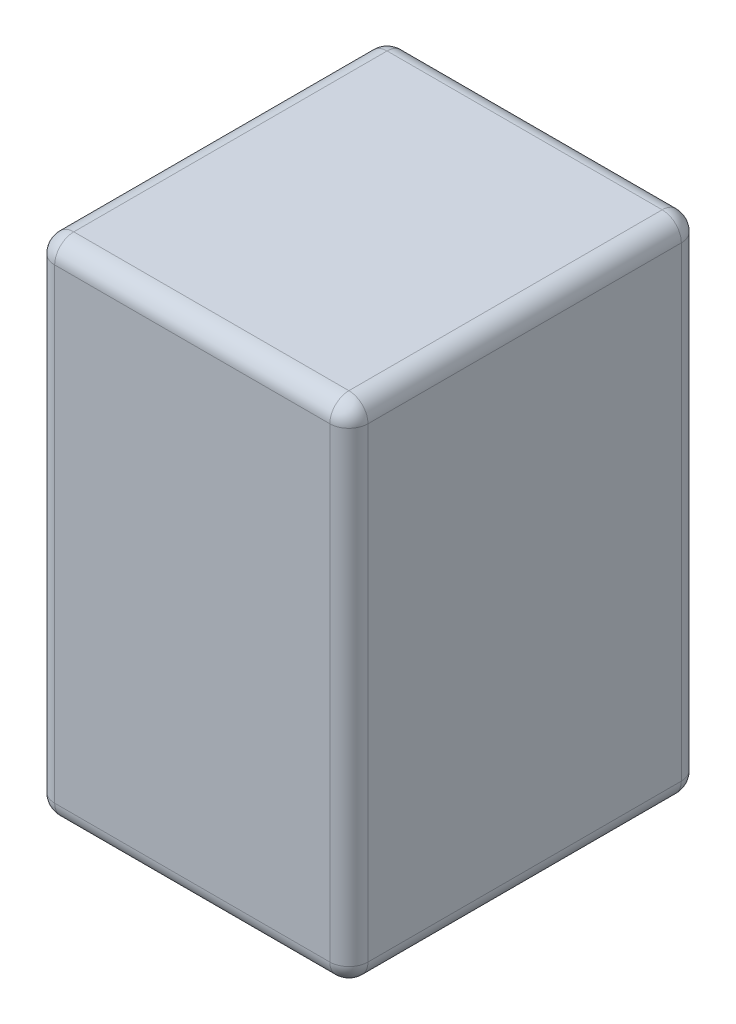
ISO-10303-21;
HEADER;
FILE_DESCRIPTION(('STEP AP214'),'2;1');
FILE_NAME('part.step','',(''),(''),'','','');
FILE_SCHEMA(('AUTOMOTIVE_DESIGN { 1 0 10303 214 1 1 1 1 }'));
ENDSEC;
DATA;
#1=APPLICATION_CONTEXT('core data for automotive mechanical design processes');
#2=APPLICATION_PROTOCOL_DEFINITION('international standard','automotive_design',2000,#1);
#3=PRODUCT_CONTEXT('',#1,'mechanical');
#4=PRODUCT('Part','Part','',(#3));
#5=PRODUCT_RELATED_PRODUCT_CATEGORY('part','',(#4));
#6=PRODUCT_DEFINITION_FORMATION('','',#4);
#7=PRODUCT_DEFINITION_CONTEXT('part definition',#1,'design');
#8=PRODUCT_DEFINITION('design','',#6,#7);
#9=PRODUCT_DEFINITION_SHAPE('','',#8);
#10=(LENGTH_UNIT() NAMED_UNIT(*) SI_UNIT(.MILLI.,.METRE.));
#11=(NAMED_UNIT(*) PLANE_ANGLE_UNIT() SI_UNIT($,.RADIAN.));
#12=(NAMED_UNIT(*) SI_UNIT($,.STERADIAN.) SOLID_ANGLE_UNIT());
#13=UNCERTAINTY_MEASURE_WITH_UNIT(LENGTH_MEASURE(1.E-05),#10,'distance_accuracy_value','');
#14=(GEOMETRIC_REPRESENTATION_CONTEXT(3) GLOBAL_UNCERTAINTY_ASSIGNED_CONTEXT((#13)) GLOBAL_UNIT_ASSIGNED_CONTEXT((#10,
#11,#12)) REPRESENTATION_CONTEXT('',''));
#15=CARTESIAN_POINT('',(0.,0.,0.));
#16=DIRECTION('',(0.,0.,1.));
#17=DIRECTION('',(1.,0.,0.));
#18=AXIS2_PLACEMENT_3D('',#15,#16,#17);
#19=CARTESIAN_POINT('',(-1.290000620004,-1.585000628965,-1.696601987956));
#20=DIRECTION('',(-0.577350243952984,0.577350243952984,0.577350319662907));
#21=DIRECTION('',(-0.707106812094995,-0.707106750278096,-6.18168906341143E-08));
#22=AXIS2_PLACEMENT_3D('',#19,#20,#21);
#23=SPHERICAL_SURFACE('',#22,0.075);
#24=CARTESIAN_POINT('',(-1.33330188830047,-1.54169936066853,-1.65330071398128));
#25=VERTEX_POINT('',#24);
#26=VERTEX_LOOP('',#25);
#27=FACE_BOUND('',#26,.T.);
#28=CARTESIAN_POINT('',(-1.29000062000394,-1.58500062896529,-1.69660198795589));
#29=DIRECTION('',(4.37113884619598E-08,0.999999999999995,8.74227765734796E-08));
#30=DIRECTION('',(0.,-8.74227765734797E-08,0.999999999999996));
#31=AXIS2_PLACEMENT_3D('',#28,#29,#30);
#32=CIRCLE('',#31,0.075);
#33=CARTESIAN_POINT('',(-1.29000065999997,-1.585000635522,-1.62160198795552));
#34=VERTEX_POINT('',#33);
#35=CARTESIAN_POINT('',(-1.36500062000399,-1.58500062568698,-1.69660198795594));
#36=VERTEX_POINT('',#35);
#37=EDGE_CURVE('E129',#34,#36,#32,.F.);
#38=ORIENTED_EDGE('',*,*,#37,.F.);
#39=CARTESIAN_POINT('',(-1.29000062000435,-1.5850006289651,-1.696601987956));
#40=DIRECTION('',(0.999999999999999,-4.371138839957E-08,0.));
#41=DIRECTION('',(4.371138839957E-08,0.999999999999999,0.));
#42=AXIS2_PLACEMENT_3D('',#39,#40,#41);
#43=CIRCLE('',#42,0.075);
#44=CARTESIAN_POINT('',(-1.29000061672582,-1.51000062896492,-1.69660198139929));
#45=VERTEX_POINT('',#44);
#46=EDGE_CURVE('E132',#45,#34,#43,.T.);
#47=ORIENTED_EDGE('',*,*,#46,.F.);
#48=CARTESIAN_POINT('',(-1.290000620004,-1.58500062896529,-1.696601987956));
#49=DIRECTION('',(0.,8.74227765734797E-08,-0.999999999999996));
#50=DIRECTION('',(0.,0.999999999999996,8.74227765734797E-08));
#51=AXIS2_PLACEMENT_3D('',#48,#49,#50);
#52=CIRCLE('',#51,0.075);
#53=EDGE_CURVE('E21',#36,#45,#52,.T.);
#54=ORIENTED_EDGE('',*,*,#53,.F.);
#55=EDGE_LOOP('',(#38,#47,#54));
#56=FACE_BOUND('',#55,.T.);
#57=ADVANCED_FACE('F17',(#27,#56),#23,.T.);
#58=CARTESIAN_POINT('',(-1.290000699996,-3.415000628965,-1.696602147939));
#59=DIRECTION('',(-0.577350294426269,-0.577350294426303,0.577350218716303));
#60=DIRECTION('',(-3.09084125238446E-08,-0.707106719369619,-0.70710684300347));
#61=AXIS2_PLACEMENT_3D('',#58,#59,#60);
#62=SPHERICAL_SURFACE('',#61,0.075);
#63=CARTESIAN_POINT('',(-1.33330197207797,-3.45830190104697,-1.65330088153528));
#64=VERTEX_POINT('',#63);
#65=VERTEX_LOOP('',#64);
#66=FACE_BOUND('',#65,.T.);
#67=CARTESIAN_POINT('',(-1.29000069999578,-3.41500062896535,-1.69660214793957));
#68=DIRECTION('',(4.37113884619598E-08,0.999999999999995,8.74227765734796E-08));
#69=DIRECTION('',(0.,-8.74227765734797E-08,0.999999999999996));
#70=AXIS2_PLACEMENT_3D('',#67,#68,#69);
#71=CIRCLE('',#70,0.075);
#72=CARTESIAN_POINT('',(-1.36500069999589,-3.415000625687,-1.69660214793949));
#73=VERTEX_POINT('',#72);
#74=CARTESIAN_POINT('',(-1.290000699996,-3.41500065912565,-1.62160214793884));
#75=VERTEX_POINT('',#74);
#76=EDGE_CURVE('E143',#73,#75,#71,.T.);
#77=ORIENTED_EDGE('',*,*,#76,.F.);
#78=CARTESIAN_POINT('',(-1.290000699996,-3.41500062896529,-1.69660214793929));
#79=DIRECTION('',(0.,8.74227765734797E-08,-0.999999999999996));
#80=DIRECTION('',(0.,0.999999999999996,8.74227765734797E-08));
#81=AXIS2_PLACEMENT_3D('',#78,#79,#80);
#82=CIRCLE('',#81,0.075);
#83=CARTESIAN_POINT('',(-1.29000070327418,-3.49000062896479,-1.696602154496));
#84=VERTEX_POINT('',#83);
#85=EDGE_CURVE('E239',#84,#73,#82,.T.);
#86=ORIENTED_EDGE('',*,*,#85,.F.);
#87=CARTESIAN_POINT('',(-1.290000699996,-3.4150006289646,-1.696602147939));
#88=DIRECTION('',(-0.999999999999999,4.371138851239E-08,0.));
#89=DIRECTION('',(-4.371138851239E-08,-0.999999999999999,0.));
#90=AXIS2_PLACEMENT_3D('',#87,#88,#89);
#91=CIRCLE('',#90,0.075);
#92=EDGE_CURVE('E157',#75,#84,#91,.F.);
#93=ORIENTED_EDGE('',*,*,#92,.F.);
#94=EDGE_LOOP('',(#77,#86,#93));
#95=FACE_BOUND('',#94,.T.);
#96=ADVANCED_FACE('F128',(#66,#95),#62,.T.);
#97=CARTESIAN_POINT('',(-1.290000620004,-1.585000521435,-2.926601987956));
#98=DIRECTION('',(-0.577350243952984,0.577350344899943,-0.577350218715943));
#99=DIRECTION('',(3.09087684891019E-08,0.707106719369326,0.707106843003763));
#100=AXIS2_PLACEMENT_3D('',#97,#98,#99);
#101=SPHERICAL_SURFACE('',#100,0.075);
#102=CARTESIAN_POINT('',(-1.33330188830047,-1.5416992455675,-2.9699032543597));
#103=VERTEX_POINT('',#102);
#104=VERTEX_LOOP('',#103);
#105=FACE_BOUND('',#104,.T.);
#106=CARTESIAN_POINT('',(-1.29000062000394,-1.58500052143535,-2.92660198795588));
#107=DIRECTION('',(4.37113884619598E-08,0.999999999999995,8.74227765734796E-08));
#108=DIRECTION('',(0.,-8.74227765734797E-08,0.999999999999996));
#109=AXIS2_PLACEMENT_3D('',#106,#107,#108);
#110=CIRCLE('',#109,0.075);
#111=CARTESIAN_POINT('',(-1.36500062000397,-1.585000518157,-2.9266019879556));
#112=VERTEX_POINT('',#111);
#113=CARTESIAN_POINT('',(-1.29000066,-1.58500051487832,-3.00160198795555));
#114=VERTEX_POINT('',#113);
#115=EDGE_CURVE('E360',#112,#114,#110,.F.);
#116=ORIENTED_EDGE('',*,*,#115,.F.);
#117=CARTESIAN_POINT('',(-1.290000620004,-1.58500052143528,-2.92660198795571));
#118=DIRECTION('',(0.,8.74227765734797E-08,-0.999999999999996));
#119=DIRECTION('',(0.,0.999999999999996,8.74227765734797E-08));
#120=AXIS2_PLACEMENT_3D('',#117,#118,#119);
#121=CIRCLE('',#120,0.075);
#122=CARTESIAN_POINT('',(-1.29000061672582,-1.51000052143491,-2.926601981399));
#123=VERTEX_POINT('',#122);
#124=EDGE_CURVE('E374',#123,#112,#121,.F.);
#125=ORIENTED_EDGE('',*,*,#124,.F.);
#126=CARTESIAN_POINT('',(-1.290000620004,-1.5850005214351,-2.926601987956));
#127=DIRECTION('',(0.999999999999999,-4.371138839957E-08,0.));
#128=DIRECTION('',(4.371138839957E-08,0.999999999999999,0.));
#129=AXIS2_PLACEMENT_3D('',#126,#127,#128);
#130=CIRCLE('',#129,0.075);
#131=EDGE_CURVE('E366',#114,#123,#130,.T.);
#132=ORIENTED_EDGE('',*,*,#131,.F.);
#133=EDGE_LOOP('',(#116,#125,#132));
#134=FACE_BOUND('',#133,.T.);
#135=ADVANCED_FACE('F223',(#105,#134),#101,.T.);
#136=CARTESIAN_POINT('',(-1.290000699996,-3.415000521435,-2.926602147939));
#137=DIRECTION('',(-0.577350294426266,-0.577350193479302,-0.577350319663302));
#138=DIRECTION('',(3.09087739291947E-08,0.707106843003762,-0.707106719369327));
#139=AXIS2_PLACEMENT_3D('',#136,#137,#138);
#140=SPHERICAL_SURFACE('',#139,0.075);
#141=CARTESIAN_POINT('',(-1.33330197207797,-3.45830178594595,-2.96990342191375));
#142=VERTEX_POINT('',#141);
#143=VERTEX_LOOP('',#142);
#144=FACE_BOUND('',#143,.T.);
#145=CARTESIAN_POINT('',(-1.29000069999578,-3.41500052143471,-2.92660214793957));
#146=DIRECTION('',(4.37113884619598E-08,0.999999999999995,8.74227765734796E-08));
#147=DIRECTION('',(0.,-8.74227765734797E-08,0.999999999999996));
#148=AXIS2_PLACEMENT_3D('',#145,#146,#147);
#149=CIRCLE('',#148,0.075);
#150=CARTESIAN_POINT('',(-1.29000069999582,-3.41500053848195,-3.00160214793884));
#151=VERTEX_POINT('',#150);
#152=CARTESIAN_POINT('',(-1.36500069999595,-3.41500051815667,-2.92660214793928));
#153=VERTEX_POINT('',#152);
#154=EDGE_CURVE('E232',#151,#153,#149,.T.);
#155=ORIENTED_EDGE('',*,*,#154,.F.);
#156=CARTESIAN_POINT('',(-1.29000069999565,-3.4150005214346,-2.926602147939));
#157=DIRECTION('',(-0.999999999999999,4.371138851239E-08,0.));
#158=DIRECTION('',(-4.371138851239E-08,-0.999999999999999,0.));
#159=AXIS2_PLACEMENT_3D('',#156,#157,#158);
#160=CIRCLE('',#159,0.075);
#161=CARTESIAN_POINT('',(-1.29000070327418,-3.49000052143478,-2.92660215449571));
#162=VERTEX_POINT('',#161);
#163=EDGE_CURVE('E363',#162,#151,#160,.F.);
#164=ORIENTED_EDGE('',*,*,#163,.F.);
#165=CARTESIAN_POINT('',(-1.290000699996,-3.41500052143528,-2.926602147939));
#166=DIRECTION('',(0.,8.74227765734797E-08,-0.999999999999996));
#167=DIRECTION('',(0.,0.999999999999996,8.74227765734797E-08));
#168=AXIS2_PLACEMENT_3D('',#165,#166,#167);
#169=CIRCLE('',#168,0.075);
#170=EDGE_CURVE('E238',#153,#162,#169,.F.);
#171=ORIENTED_EDGE('',*,*,#170,.F.);
#172=EDGE_LOOP('',(#155,#164,#171));
#173=FACE_BOUND('',#172,.T.);
#174=ADVANCED_FACE('F218',(#144,#173),#140,.T.);
#175=CARTESIAN_POINT('',(-1.365000703274,-3.490000632243,-1.621602154496));
#176=DIRECTION('',(-0.999999999999999,4.371138846196E-08,0.));
#177=DIRECTION('',(-4.371138846196E-08,-0.999999999999999,0.));
#178=AXIS2_PLACEMENT_3D('',#175,#176,#177);
#179=PLANE('',#178);
#180=DIRECTION('',(0.,8.74227765734797E-08,-0.999999999999996));
#181=VECTOR('',#180,1.);
#182=CARTESIAN_POINT('',(-1.365000699996,-3.41500063224371,-1.621602147939));
#183=LINE('',#182,#181);
#184=EDGE_CURVE('E235',#73,#153,#183,.T.);
#185=ORIENTED_EDGE('',*,*,#184,.F.);
#186=DIRECTION('',(4.37113884619598E-08,0.999999999999995,8.74227765734796E-08));
#187=VECTOR('',#186,1.);
#188=CARTESIAN_POINT('',(-1.365000681637,-2.99500062568665,-1.69660211122212));
#189=LINE('',#188,#187);
#190=EDGE_CURVE('E136',#36,#73,#189,.F.);
#191=ORIENTED_EDGE('',*,*,#190,.F.);
#192=DIRECTION('',(0.,8.74227765734797E-08,-0.999999999999996));
#193=VECTOR('',#192,1.);
#194=CARTESIAN_POINT('',(-1.365000620004,-1.58500063224372,-1.621601987956));
#195=LINE('',#194,#193);
#196=EDGE_CURVE('E137',#112,#36,#195,.F.);
#197=ORIENTED_EDGE('',*,*,#196,.F.);
#198=DIRECTION('',(4.37113884619598E-08,0.999999999999995,8.74227765734796E-08));
#199=VECTOR('',#198,1.);
#200=CARTESIAN_POINT('',(-1.365000681637,-2.99500051815665,-2.92660211122143));
#201=LINE('',#200,#199);
#202=EDGE_CURVE('E229',#153,#112,#201,.T.);
#203=ORIENTED_EDGE('',*,*,#202,.F.);
#204=EDGE_LOOP('',(#185,#191,#197,#203));
#205=FACE_BOUND('',#204,.T.);
#206=ADVANCED_FACE('F214',(#205),#179,.T.);
#207=CARTESIAN_POINT('',(-1.290000620004,-1.585000635522,-1.621601987956));
#208=DIRECTION('',(0.,8.74227765734797E-08,-0.999999999999996));
#209=DIRECTION('',(0.,0.999999999999996,8.74227765734797E-08));
#210=AXIS2_PLACEMENT_3D('',#207,#208,#209);
#211=CYLINDRICAL_SURFACE('',#210,0.075);
#212=ORIENTED_EDGE('',*,*,#124,.T.);
#213=ORIENTED_EDGE('',*,*,#196,.T.);
#214=ORIENTED_EDGE('',*,*,#53,.T.);
#215=DIRECTION('',(0.,-8.74227765734797E-08,0.999999999999996));
#216=VECTOR('',#215,1.);
#217=CARTESIAN_POINT('',(-1.290000616726,-1.51000063552135,-1.621601981399));
#218=LINE('',#217,#216);
#219=EDGE_CURVE('E228',#123,#45,#218,.T.);
#220=ORIENTED_EDGE('',*,*,#219,.F.);
#221=EDGE_LOOP('',(#212,#213,#214,#220));
#222=FACE_BOUND('',#221,.T.);
#223=ADVANCED_FACE('F211',(#222),#211,.T.);
#224=CARTESIAN_POINT('',(-1.290000681637,-2.995000628965,-1.696602111222));
#225=DIRECTION('',(4.37113884619598E-08,0.999999999999995,8.74227765734796E-08));
#226=DIRECTION('',(0.,-8.74227765734797E-08,0.999999999999996));
#227=AXIS2_PLACEMENT_3D('',#224,#225,#226);
#228=CYLINDRICAL_SURFACE('',#227,0.075);
#229=ORIENTED_EDGE('',*,*,#76,.T.);
#230=DIRECTION('',(0.,0.999999999999996,8.74227765734797E-08));
#231=VECTOR('',#230,1.);
#232=CARTESIAN_POINT('',(-1.290000699996,-2.500000659126,-1.621602067947));
#233=LINE('',#232,#231);
#234=EDGE_CURVE('E141',#75,#34,#233,.T.);
#235=ORIENTED_EDGE('',*,*,#234,.T.);
#236=ORIENTED_EDGE('',*,*,#37,.T.);
#237=ORIENTED_EDGE('',*,*,#190,.T.);
#238=EDGE_LOOP('',(#229,#235,#236,#237));
#239=FACE_BOUND('',#238,.T.);
#240=ADVANCED_FACE('F142',(#239),#228,.T.);
#241=CARTESIAN_POINT('',(-1.057500620004,-1.585000639128,-1.696601987956));
#242=DIRECTION('',(0.999999999999999,-4.371138839957E-08,0.));
#243=DIRECTION('',(4.371138839957E-08,0.999999999999999,0.));
#244=AXIS2_PLACEMENT_3D('',#241,#242,#243);
#245=CYLINDRICAL_SURFACE('',#244,0.075);
#246=CARTESIAN_POINT('',(-0.210000620004,-1.5850006761734,-1.696601987956));
#247=DIRECTION('',(0.999999999999999,-4.371138839957E-08,0.));
#248=DIRECTION('',(4.371138839957E-08,0.999999999999999,0.));
#249=AXIS2_PLACEMENT_3D('',#246,#247,#248);
#250=CIRCLE('',#249,0.075);
#251=CARTESIAN_POINT('',(-0.210000618364823,-1.51000067617303,-1.696601981399));
#252=VERTEX_POINT('',#251);
#253=CARTESIAN_POINT('',(-0.210000620003999,-1.58500065912618,-1.62160198795544));
#254=VERTEX_POINT('',#253);
#255=EDGE_CURVE('E356',#252,#254,#250,.T.);
#256=ORIENTED_EDGE('',*,*,#255,.F.);
#257=DIRECTION('',(0.999999999999999,-4.37113883995696E-08,0.));
#258=VECTOR('',#257,1.);
#259=CARTESIAN_POINT('',(-1.365000616726,-1.51000062568629,-1.696601981399));
#260=LINE('',#259,#258);
#261=EDGE_CURVE('E155',#45,#252,#260,.T.);
#262=ORIENTED_EDGE('',*,*,#261,.F.);
#263=ORIENTED_EDGE('',*,*,#46,.T.);
#264=DIRECTION('',(1.,0.,0.));
#265=VECTOR('',#264,1.);
#266=CARTESIAN_POINT('',(-0.75000066,-1.585000635522,-1.62160198795516));
#267=LINE('',#266,#265);
#268=EDGE_CURVE('E147',#34,#254,#267,.T.);
#269=ORIENTED_EDGE('',*,*,#268,.T.);
#270=EDGE_LOOP('',(#256,#262,#263,#269));
#271=FACE_BOUND('',#270,.T.);
#272=ADVANCED_FACE('F152',(#271),#245,.T.);
#273=CARTESIAN_POINT('',(-0.442500699996,-3.41500066601,-1.696602147939));
#274=DIRECTION('',(-0.999999999999999,4.371138851239E-08,0.));
#275=DIRECTION('',(-4.371138851239E-08,-0.999999999999999,0.));
#276=AXIS2_PLACEMENT_3D('',#273,#274,#275);
#277=CYLINDRICAL_SURFACE('',#276,0.075);
#278=ORIENTED_EDGE('',*,*,#92,.T.);
#279=DIRECTION('',(0.999999999999999,-4.37113885123896E-08,0.));
#280=VECTOR('',#279,1.);
#281=CARTESIAN_POINT('',(-0.135000703274,-3.49000067945129,-1.696602154496));
#282=LINE('',#281,#280);
#283=CARTESIAN_POINT('',(-0.210000703274177,-3.49000067617311,-1.69660215449571));
#284=VERTEX_POINT('',#283);
#285=EDGE_CURVE('E312',#284,#84,#282,.F.);
#286=ORIENTED_EDGE('',*,*,#285,.F.);
#287=CARTESIAN_POINT('',(-0.210000699995646,-3.4150006761729,-1.696602147939));
#288=DIRECTION('',(-0.999999999999999,4.371138851239E-08,0.));
#289=DIRECTION('',(-4.371138851239E-08,-0.999999999999999,0.));
#290=AXIS2_PLACEMENT_3D('',#287,#288,#289);
#291=CIRCLE('',#290,0.075);
#292=CARTESIAN_POINT('',(-0.210000659999921,-3.41500068273,-1.62160214793891));
#293=VERTEX_POINT('',#292);
#294=EDGE_CURVE('E164',#293,#284,#291,.F.);
#295=ORIENTED_EDGE('',*,*,#294,.F.);
#296=DIRECTION('',(1.,0.,0.));
#297=VECTOR('',#296,1.);
#298=CARTESIAN_POINT('',(-0.75000066,-3.41500068273,-1.62160214793884));
#299=LINE('',#298,#297);
#300=EDGE_CURVE('E148',#293,#75,#299,.F.);
#301=ORIENTED_EDGE('',*,*,#300,.T.);
#302=EDGE_LOOP('',(#278,#286,#295,#301));
#303=FACE_BOUND('',#302,.T.);
#304=ADVANCED_FACE('F202',(#303),#277,.T.);
#305=CARTESIAN_POINT('',(-1.290000699996,-3.415000635522,-1.621602147939));
#306=DIRECTION('',(0.,8.74227765734797E-08,-0.999999999999996));
#307=DIRECTION('',(0.,0.999999999999996,8.74227765734797E-08));
#308=AXIS2_PLACEMENT_3D('',#305,#306,#307);
#309=CYLINDRICAL_SURFACE('',#308,0.075);
#310=ORIENTED_EDGE('',*,*,#170,.T.);
#311=DIRECTION('',(0.,8.74227765734797E-08,-0.999999999999996));
#312=VECTOR('',#311,1.);
#313=CARTESIAN_POINT('',(-1.290000703274,-3.49000063552135,-1.621602154496));
#314=LINE('',#313,#312);
#315=EDGE_CURVE('E315',#84,#162,#314,.T.);
#316=ORIENTED_EDGE('',*,*,#315,.F.);
#317=ORIENTED_EDGE('',*,*,#85,.T.);
#318=ORIENTED_EDGE('',*,*,#184,.T.);
#319=EDGE_LOOP('',(#310,#316,#317,#318));
#320=FACE_BOUND('',#319,.T.);
#321=ADVANCED_FACE('F198',(#320),#309,.T.);
#322=CARTESIAN_POINT('',(-1.057500620004,-1.585000531598,-2.926601987956));
#323=DIRECTION('',(0.999999999999999,-4.371138839957E-08,0.));
#324=DIRECTION('',(4.371138839957E-08,0.999999999999999,0.));
#325=AXIS2_PLACEMENT_3D('',#322,#323,#324);
#326=CYLINDRICAL_SURFACE('',#325,0.075);
#327=CARTESIAN_POINT('',(-0.210000620004354,-1.5850005686434,-2.926601987956));
#328=DIRECTION('',(0.999999999999999,-4.371138839957E-08,0.));
#329=DIRECTION('',(4.371138839957E-08,0.999999999999999,0.));
#330=AXIS2_PLACEMENT_3D('',#327,#328,#329);
#331=CIRCLE('',#330,0.075);
#332=CARTESIAN_POINT('',(-0.210000620004284,-1.58500053848235,-3.00160198795536));
#333=VERTEX_POINT('',#332);
#334=CARTESIAN_POINT('',(-0.210000618364823,-1.51000056864302,-2.92660198139915));
#335=VERTEX_POINT('',#334);
#336=EDGE_CURVE('E353',#333,#335,#331,.T.);
#337=ORIENTED_EDGE('',*,*,#336,.F.);
#338=DIRECTION('',(1.,0.,0.));
#339=VECTOR('',#338,1.);
#340=CARTESIAN_POINT('',(-0.75000066,-1.585000514878,-3.00160198795516));
#341=LINE('',#340,#339);
#342=EDGE_CURVE('E297',#114,#333,#341,.T.);
#343=ORIENTED_EDGE('',*,*,#342,.F.);
#344=ORIENTED_EDGE('',*,*,#131,.T.);
#345=DIRECTION('',(0.999999999999999,-4.37113883995696E-08,0.));
#346=VECTOR('',#345,1.);
#347=CARTESIAN_POINT('',(-1.365000616726,-1.51000051815628,-2.926601981399));
#348=LINE('',#347,#346);
#349=EDGE_CURVE('E231',#335,#123,#348,.F.);
#350=ORIENTED_EDGE('',*,*,#349,.F.);
#351=EDGE_LOOP('',(#337,#343,#344,#350));
#352=FACE_BOUND('',#351,.T.);
#353=ADVANCED_FACE('F194',(#352),#326,.T.);
#354=CARTESIAN_POINT('',(-0.442500699996,-3.41500055848,-2.926602147939));
#355=DIRECTION('',(-0.999999999999999,4.371138851239E-08,0.));
#356=DIRECTION('',(-4.371138851239E-08,-0.999999999999999,0.));
#357=AXIS2_PLACEMENT_3D('',#354,#355,#356);
#358=CYLINDRICAL_SURFACE('',#357,0.075);
#359=ORIENTED_EDGE('',*,*,#163,.T.);
#360=DIRECTION('',(1.,0.,0.));
#361=VECTOR('',#360,1.);
#362=CARTESIAN_POINT('',(-0.75000066,-3.415000562086,-3.00160214793884));
#363=LINE('',#362,#361);
#364=CARTESIAN_POINT('',(-0.210000679998044,-3.41500057552772,-3.00160214793898));
#365=VERTEX_POINT('',#364);
#366=EDGE_CURVE('E294',#365,#151,#363,.F.);
#367=ORIENTED_EDGE('',*,*,#366,.F.);
#368=CARTESIAN_POINT('',(-0.210000699996,-3.4150005686429,-2.926602147939));
#369=DIRECTION('',(-0.999999999999999,4.371138851239E-08,0.));
#370=DIRECTION('',(-4.371138851239E-08,-0.999999999999999,0.));
#371=AXIS2_PLACEMENT_3D('',#368,#369,#370);
#372=CIRCLE('',#371,0.075);
#373=CARTESIAN_POINT('',(-0.210000703274177,-3.49000056864319,-2.92660215449586));
#374=VERTEX_POINT('',#373);
#375=EDGE_CURVE('E302',#374,#365,#372,.F.);
#376=ORIENTED_EDGE('',*,*,#375,.F.);
#377=DIRECTION('',(0.999999999999999,-4.37113885123896E-08,0.));
#378=VECTOR('',#377,1.);
#379=CARTESIAN_POINT('',(-0.135000703274,-3.49000057192128,-2.926602154496));
#380=LINE('',#379,#378);
#381=EDGE_CURVE('E167',#162,#374,#380,.T.);
#382=ORIENTED_EDGE('',*,*,#381,.F.);
#383=EDGE_LOOP('',(#359,#367,#376,#382));
#384=FACE_BOUND('',#383,.T.);
#385=ADVANCED_FACE('F190',(#384),#358,.T.);
#386=CARTESIAN_POINT('',(-1.290000681637,-2.995000521435,-2.926602111222));
#387=DIRECTION('',(4.37113884619598E-08,0.999999999999995,8.74227765734796E-08));
#388=DIRECTION('',(0.,-8.74227765734797E-08,0.999999999999996));
#389=AXIS2_PLACEMENT_3D('',#386,#387,#388);
#390=CYLINDRICAL_SURFACE('',#389,0.075);
#391=ORIENTED_EDGE('',*,*,#154,.T.);
#392=ORIENTED_EDGE('',*,*,#202,.T.);
#393=ORIENTED_EDGE('',*,*,#115,.T.);
#394=DIRECTION('',(0.,0.999999999999996,8.74227765734797E-08));
#395=VECTOR('',#394,1.);
#396=CARTESIAN_POINT('',(-1.290000699996,-2.500000538482,-3.001602067947));
#397=LINE('',#396,#395);
#398=EDGE_CURVE('E296',#151,#114,#397,.T.);
#399=ORIENTED_EDGE('',*,*,#398,.F.);
#400=EDGE_LOOP('',(#391,#392,#393,#399));
#401=FACE_BOUND('',#400,.T.);
#402=ADVANCED_FACE('F186',(#401),#390,.T.);
#403=CARTESIAN_POINT('',(-1.365000616726,-1.510000632243,-1.621601981399));
#404=DIRECTION('',(4.37113883995698E-08,0.999999999999995,8.74227765734796E-08));
#405=DIRECTION('',(0.,-8.74227765734797E-08,0.999999999999996));
#406=AXIS2_PLACEMENT_3D('',#403,#404,#405);
#407=PLANE('',#406);
#408=ORIENTED_EDGE('',*,*,#261,.T.);
#409=DIRECTION('',(0.,8.74227765734797E-08,-0.999999999999996));
#410=VECTOR('',#409,1.);
#411=CARTESIAN_POINT('',(-0.210000620004,-1.51000068273,-1.62160198139929));
#412=LINE('',#411,#410);
#413=EDGE_CURVE('E174',#335,#252,#412,.F.);
#414=ORIENTED_EDGE('',*,*,#413,.F.);
#415=ORIENTED_EDGE('',*,*,#349,.T.);
#416=ORIENTED_EDGE('',*,*,#219,.T.);
#417=EDGE_LOOP('',(#408,#414,#415,#416));
#418=FACE_BOUND('',#417,.T.);
#419=ADVANCED_FACE('F181',(#418),#407,.T.);
#420=CARTESIAN_POINT('',(-0.210000620004,-1.585000676173,-1.696601987956));
#421=DIRECTION('',(0.577350294426321,0.577350193479228,0.577350319663321));
#422=DIRECTION('',(0.707106781186407,3.09091705286146E-08,-0.707106781186687));
#423=AXIS2_PLACEMENT_3D('',#420,#421,#422);
#424=SPHERICAL_SURFACE('',#423,0.075);
#425=CARTESIAN_POINT('',(-0.166699347922026,-1.54169941166206,-1.65330071398125));
#426=VERTEX_POINT('',#425);
#427=VERTEX_LOOP('',#426);
#428=FACE_BOUND('',#427,.T.);
#429=CARTESIAN_POINT('',(-0.210000620004217,-1.58500067617365,-1.69660198795543));
#430=DIRECTION('',(-4.37113885320498E-08,-0.999999999999995,-8.74227765734796E-08));
#431=DIRECTION('',(0.,8.74227765734797E-08,-0.999999999999996));
#432=AXIS2_PLACEMENT_3D('',#429,#430,#431);
#433=CIRCLE('',#432,0.075);
#434=CARTESIAN_POINT('',(-0.135000620004349,-1.585000625687,-1.69660198795572));
#435=VERTEX_POINT('',#434);
#436=EDGE_CURVE('E341',#435,#254,#433,.T.);
#437=ORIENTED_EDGE('',*,*,#436,.F.);
#438=CARTESIAN_POINT('',(-0.210000620004,-1.58500067617329,-1.69660198795571));
#439=DIRECTION('',(0.,8.74227765734797E-08,-0.999999999999996));
#440=DIRECTION('',(0.,0.999999999999996,8.74227765734797E-08));
#441=AXIS2_PLACEMENT_3D('',#438,#439,#440);
#442=CIRCLE('',#441,0.075);
#443=EDGE_CURVE('E349',#252,#435,#442,.T.);
#444=ORIENTED_EDGE('',*,*,#443,.F.);
#445=ORIENTED_EDGE('',*,*,#255,.T.);
#446=EDGE_LOOP('',(#437,#444,#445));
#447=FACE_BOUND('',#446,.T.);
#448=ADVANCED_FACE('F177',(#428,#447),#424,.T.);
#449=CARTESIAN_POINT('',(-0.75000066,-2.500000659126,-1.621602067947));
#450=DIRECTION('',(0.,8.74227765734797E-08,-0.999999999999996));
#451=DIRECTION('',(0.,0.999999999999996,8.74227765734797E-08));
#452=AXIS2_PLACEMENT_3D('',#449,#450,#451);
#453=PLANE('',#452);
#454=ORIENTED_EDGE('',*,*,#234,.F.);
#455=ORIENTED_EDGE('',*,*,#300,.F.);
#456=DIRECTION('',(-4.37113885320498E-08,-0.999999999999995,-8.74227765734796E-08));
#457=VECTOR('',#456,1.);
#458=CARTESIAN_POINT('',(-0.210000638362783,-2.00500068272971,-1.621602024673));
#459=LINE('',#458,#457);
#460=EDGE_CURVE('E162',#254,#293,#459,.T.);
#461=ORIENTED_EDGE('',*,*,#460,.F.);
#462=ORIENTED_EDGE('',*,*,#268,.F.);
#463=EDGE_LOOP('',(#454,#455,#461,#462));
#464=FACE_BOUND('',#463,.T.);
#465=ADVANCED_FACE('F160',(#464),#453,.F.);
#466=CARTESIAN_POINT('',(-0.210000699996,-3.415000676173,-1.696602147939));
#467=DIRECTION('',(0.577350243952984,-0.577350344899943,0.577350218715943));
#468=DIRECTION('',(-3.09087684891019E-08,-0.707106719369326,-0.707106843003763));
#469=AXIS2_PLACEMENT_3D('',#466,#467,#468);
#470=SPHERICAL_SURFACE('',#469,0.075);
#471=CARTESIAN_POINT('',(-0.166699431699526,-3.4583019520405,-1.6533008815353));
#472=VERTEX_POINT('',#471);
#473=VERTEX_LOOP('',#472);
#474=FACE_BOUND('',#473,.T.);
#475=CARTESIAN_POINT('',(-0.210000699996058,-3.41500067617329,-1.69660214793912));
#476=DIRECTION('',(-4.37113885320498E-08,-0.999999999999995,-8.74227765734796E-08));
#477=DIRECTION('',(0.,8.74227765734797E-08,-0.999999999999996));
#478=AXIS2_PLACEMENT_3D('',#475,#476,#477);
#479=CIRCLE('',#478,0.075);
#480=CARTESIAN_POINT('',(-0.135000699996195,-3.41500067945182,-1.69660206794756));
#481=VERTEX_POINT('',#480);
#482=EDGE_CURVE('E337',#293,#481,#479,.F.);
#483=ORIENTED_EDGE('',*,*,#482,.F.);
#484=ORIENTED_EDGE('',*,*,#294,.T.);
#485=CARTESIAN_POINT('',(-0.210000699996,-3.41500067617329,-1.696602147939));
#486=DIRECTION('',(0.,8.74227765734797E-08,-0.999999999999996));
#487=DIRECTION('',(0.,0.999999999999996,8.74227765734797E-08));
#488=AXIS2_PLACEMENT_3D('',#485,#486,#487);
#489=CIRCLE('',#488,0.075);
#490=EDGE_CURVE('E309',#481,#284,#489,.T.);
#491=ORIENTED_EDGE('',*,*,#490,.F.);
#492=EDGE_LOOP('',(#483,#484,#491));
#493=FACE_BOUND('',#492,.T.);
#494=ADVANCED_FACE('F318',(#474,#493),#470,.T.);
#495=CARTESIAN_POINT('',(-0.135000703274,-3.490000686008,-1.621602154496));
#496=DIRECTION('',(-4.37113885123898E-08,-0.999999999999995,-8.74227765734796E-08));
#497=DIRECTION('',(0.,8.74227765734797E-08,-0.999999999999996));
#498=AXIS2_PLACEMENT_3D('',#495,#496,#497);
#499=PLANE('',#498);
#500=ORIENTED_EDGE('',*,*,#285,.T.);
#501=ORIENTED_EDGE('',*,*,#315,.T.);
#502=ORIENTED_EDGE('',*,*,#381,.T.);
#503=DIRECTION('',(0.,8.74227765734797E-08,-0.999999999999996));
#504=VECTOR('',#503,1.);
#505=CARTESIAN_POINT('',(-0.210000703274,-3.49000068273,-1.62160215449571));
#506=LINE('',#505,#504);
#507=EDGE_CURVE('E305',#284,#374,#506,.T.);
#508=ORIENTED_EDGE('',*,*,#507,.F.);
#509=EDGE_LOOP('',(#500,#501,#502,#508));
#510=FACE_BOUND('',#509,.T.);
#511=ADVANCED_FACE('F320',(#510),#499,.T.);
#512=CARTESIAN_POINT('',(-0.210000620004,-1.585000568643,-2.926601987956));
#513=DIRECTION('',(0.577350294426501,0.577350294426501,-0.577350218715871));
#514=DIRECTION('',(-0.707106750277813,0.707106812095278,6.181747339018E-08));
#515=AXIS2_PLACEMENT_3D('',#512,#513,#514);
#516=SPHERICAL_SURFACE('',#515,0.075);
#517=CARTESIAN_POINT('',(-0.166699347922012,-1.54169929656101,-2.96990325435969));
#518=VERTEX_POINT('',#517);
#519=VERTEX_LOOP('',#518);
#520=FACE_BOUND('',#519,.T.);
#521=CARTESIAN_POINT('',(-0.210000620004216,-1.58500054503871,-2.92660198795543));
#522=DIRECTION('',(-4.37113885320498E-08,-0.999999999999995,-8.74227765734796E-08));
#523=DIRECTION('',(0.,8.74227765734797E-08,-0.999999999999996));
#524=AXIS2_PLACEMENT_3D('',#521,#522,#523);
#525=CIRCLE('',#524,0.075);
#526=CARTESIAN_POINT('',(-0.135000620004232,-1.58500056011953,-2.9266020679475));
#527=VERTEX_POINT('',#526);
#528=EDGE_CURVE('E389',#333,#527,#525,.T.);
#529=ORIENTED_EDGE('',*,*,#528,.F.);
#530=ORIENTED_EDGE('',*,*,#336,.T.);
#531=CARTESIAN_POINT('',(-0.210000620004,-1.58500056864328,-2.926601987956));
#532=DIRECTION('',(0.,8.74227765734797E-08,-0.999999999999996));
#533=DIRECTION('',(0.,0.999999999999996,8.74227765734797E-08));
#534=AXIS2_PLACEMENT_3D('',#531,#532,#533);
#535=CIRCLE('',#534,0.075);
#536=EDGE_CURVE('E344',#527,#335,#535,.F.);
#537=ORIENTED_EDGE('',*,*,#536,.F.);
#538=EDGE_LOOP('',(#529,#530,#537));
#539=FACE_BOUND('',#538,.T.);
#540=ADVANCED_FACE('F282',(#520,#539),#516,.T.);
#541=CARTESIAN_POINT('',(-0.210000699996,-3.415000568643,-2.926602147939));
#542=DIRECTION('',(0.577350243952516,-0.577350243953179,-0.577350319663179));
#543=DIRECTION('',(3.09089953076658E-08,0.707106843003757,-0.707106719369332));
#544=AXIS2_PLACEMENT_3D('',#541,#542,#543);
#545=SPHERICAL_SURFACE('',#544,0.075);
#546=CARTESIAN_POINT('',(-0.166699431699561,-3.45830183693949,-2.96990342191374));
#547=VERTEX_POINT('',#546);
#548=VERTEX_LOOP('',#547);
#549=FACE_BOUND('',#548,.T.);
#550=CARTESIAN_POINT('',(-0.210000699996059,-3.41500059552615,-2.92660214793912));
#551=DIRECTION('',(-4.37113885320498E-08,-0.999999999999995,-8.74227765734796E-08));
#552=DIRECTION('',(0.,8.74227765734797E-08,-0.999999999999996));
#553=AXIS2_PLACEMENT_3D('',#550,#551,#552);
#554=CIRCLE('',#553,0.075);
#555=CARTESIAN_POINT('',(-0.135000699996197,-3.41500062568682,-2.92660214793915));
#556=VERTEX_POINT('',#555);
#557=EDGE_CURVE('E36',#556,#365,#554,.F.);
#558=ORIENTED_EDGE('',*,*,#557,.F.);
#559=CARTESIAN_POINT('',(-0.210000699996,-3.41500056864328,-2.92660214793929));
#560=DIRECTION('',(0.,8.74227765734797E-08,-0.999999999999996));
#561=DIRECTION('',(0.,0.999999999999996,8.74227765734797E-08));
#562=AXIS2_PLACEMENT_3D('',#559,#560,#561);
#563=CIRCLE('',#562,0.075);
#564=EDGE_CURVE('E308',#374,#556,#563,.F.);
#565=ORIENTED_EDGE('',*,*,#564,.F.);
#566=ORIENTED_EDGE('',*,*,#375,.T.);
#567=EDGE_LOOP('',(#558,#565,#566));
#568=FACE_BOUND('',#567,.T.);
#569=ADVANCED_FACE('F277',(#549,#568),#545,.T.);
#570=CARTESIAN_POINT('',(-0.75000066,-2.500000538482,-3.001602067947));
#571=DIRECTION('',(0.,8.74227765734797E-08,-0.999999999999996));
#572=DIRECTION('',(0.,0.999999999999996,8.74227765734797E-08));
#573=AXIS2_PLACEMENT_3D('',#570,#571,#572);
#574=PLANE('',#573);
#575=ORIENTED_EDGE('',*,*,#366,.T.);
#576=ORIENTED_EDGE('',*,*,#398,.T.);
#577=ORIENTED_EDGE('',*,*,#342,.T.);
#578=DIRECTION('',(-4.37113885320498E-08,-0.999999999999995,-8.74227765734796E-08));
#579=VECTOR('',#578,1.);
#580=CARTESIAN_POINT('',(-0.210000638363,-2.00500056208629,-3.001602024673));
#581=LINE('',#580,#579);
#582=EDGE_CURVE('E290',#365,#333,#581,.F.);
#583=ORIENTED_EDGE('',*,*,#582,.F.);
#584=EDGE_LOOP('',(#575,#576,#577,#583));
#585=FACE_BOUND('',#584,.T.);
#586=ADVANCED_FACE('F273',(#585),#574,.T.);
#587=CARTESIAN_POINT('',(-0.210000620004,-1.58500068273,-1.621601987956));
#588=DIRECTION('',(0.,8.74227765734797E-08,-0.999999999999996));
#589=DIRECTION('',(0.,0.999999999999996,8.74227765734797E-08));
#590=AXIS2_PLACEMENT_3D('',#587,#588,#589);
#591=CYLINDRICAL_SURFACE('',#590,0.075);
#592=ORIENTED_EDGE('',*,*,#536,.T.);
#593=ORIENTED_EDGE('',*,*,#413,.T.);
#594=ORIENTED_EDGE('',*,*,#443,.T.);
#595=DIRECTION('',(0.,0.,1.));
#596=VECTOR('',#595,1.);
#597=CARTESIAN_POINT('',(-0.135000620004349,-1.585000571922,-1.621601981399));
#598=LINE('',#597,#596);
#599=EDGE_CURVE('E293',#527,#435,#598,.T.);
#600=ORIENTED_EDGE('',*,*,#599,.F.);
#601=EDGE_LOOP('',(#592,#593,#594,#600));
#602=FACE_BOUND('',#601,.T.);
#603=ADVANCED_FACE('F269',(#602),#591,.T.);
#604=CARTESIAN_POINT('',(-0.210000638363,-2.005000676173,-1.696602024673));
#605=DIRECTION('',(-4.37113885320498E-08,-0.999999999999995,-8.74227765734796E-08));
#606=DIRECTION('',(0.,8.74227765734797E-08,-0.999999999999996));
#607=AXIS2_PLACEMENT_3D('',#604,#605,#606);
#608=CYLINDRICAL_SURFACE('',#607,0.075);
#609=ORIENTED_EDGE('',*,*,#482,.T.);
#610=DIRECTION('',(4.371138853205E-08,0.999999999999999,0.));
#611=VECTOR('',#610,1.);
#612=CARTESIAN_POINT('',(-0.135000616726,-1.510000686008,-1.696601987956));
#613=LINE('',#612,#611);
#614=EDGE_CURVE('E289',#435,#481,#613,.F.);
#615=ORIENTED_EDGE('',*,*,#614,.F.);
#616=ORIENTED_EDGE('',*,*,#436,.T.);
#617=ORIENTED_EDGE('',*,*,#460,.T.);
#618=EDGE_LOOP('',(#609,#615,#616,#617));
#619=FACE_BOUND('',#618,.T.);
#620=ADVANCED_FACE('F265',(#619),#608,.T.);
#621=CARTESIAN_POINT('',(-0.210000699996,-3.41500068273,-1.621602147939));
#622=DIRECTION('',(0.,8.74227765734797E-08,-0.999999999999996));
#623=DIRECTION('',(0.,0.999999999999996,8.74227765734797E-08));
#624=AXIS2_PLACEMENT_3D('',#621,#622,#623);
#625=CYLINDRICAL_SURFACE('',#624,0.075);
#626=ORIENTED_EDGE('',*,*,#564,.T.);
#627=DIRECTION('',(0.,0.,1.));
#628=VECTOR('',#627,1.);
#629=CARTESIAN_POINT('',(-0.135000699996195,-3.415000679452,-1.621601981399));
#630=LINE('',#629,#628);
#631=EDGE_CURVE('E27',#481,#556,#630,.F.);
#632=ORIENTED_EDGE('',*,*,#631,.F.);
#633=ORIENTED_EDGE('',*,*,#490,.T.);
#634=ORIENTED_EDGE('',*,*,#507,.T.);
#635=EDGE_LOOP('',(#626,#632,#633,#634));
#636=FACE_BOUND('',#635,.T.);
#637=ADVANCED_FACE('F258',(#636),#625,.T.);
#638=CARTESIAN_POINT('',(-0.210000638363,-2.005000568643,-2.926602024673));
#639=DIRECTION('',(-4.37113885320498E-08,-0.999999999999995,-8.74227765734796E-08));
#640=DIRECTION('',(0.,8.74227765734797E-08,-0.999999999999996));
#641=AXIS2_PLACEMENT_3D('',#638,#639,#640);
#642=CYLINDRICAL_SURFACE('',#641,0.075);
#643=ORIENTED_EDGE('',*,*,#557,.T.);
#644=ORIENTED_EDGE('',*,*,#582,.T.);
#645=ORIENTED_EDGE('',*,*,#528,.T.);
#646=DIRECTION('',(4.371138853205E-08,0.999999999999999,0.));
#647=VECTOR('',#646,1.);
#648=CARTESIAN_POINT('',(-0.135000616726005,-1.510000686008,-2.926602147939));
#649=LINE('',#648,#647);
#650=EDGE_CURVE('E11',#556,#527,#649,.T.);
#651=ORIENTED_EDGE('',*,*,#650,.F.);
#652=EDGE_LOOP('',(#643,#644,#645,#651));
#653=FACE_BOUND('',#652,.T.);
#654=ADVANCED_FACE('F252',(#653),#642,.T.);
#655=CARTESIAN_POINT('',(-0.135000616726,-1.510000686008,-1.621601981399));
#656=DIRECTION('',(0.999999999999999,-4.371138853205E-08,0.));
#657=DIRECTION('',(4.371138853205E-08,0.999999999999999,0.));
#658=AXIS2_PLACEMENT_3D('',#655,#656,#657);
#659=PLANE('',#658);
#660=ORIENTED_EDGE('',*,*,#631,.T.);
#661=ORIENTED_EDGE('',*,*,#650,.T.);
#662=ORIENTED_EDGE('',*,*,#599,.T.);
#663=ORIENTED_EDGE('',*,*,#614,.T.);
#664=EDGE_LOOP('',(#660,#661,#662,#663));
#665=FACE_BOUND('',#664,.T.);
#666=ADVANCED_FACE('F250',(#665),#659,.T.);
#667=CLOSED_SHELL('',(#57,#96,#135,#174,#206,#223,#240,#272,#304,#321,#353,#385,#402,#419,#448,
#465,#494,#511,#540,#569,#586,#603,#620,#637,#654,#666));
#668=MANIFOLD_SOLID_BREP('B1',#667);
#669=ADVANCED_BREP_SHAPE_REPRESENTATION('',(#18,#668),#14);
#670=SHAPE_DEFINITION_REPRESENTATION(#9,#669);
ENDSEC;
END-ISO-10303-21;
